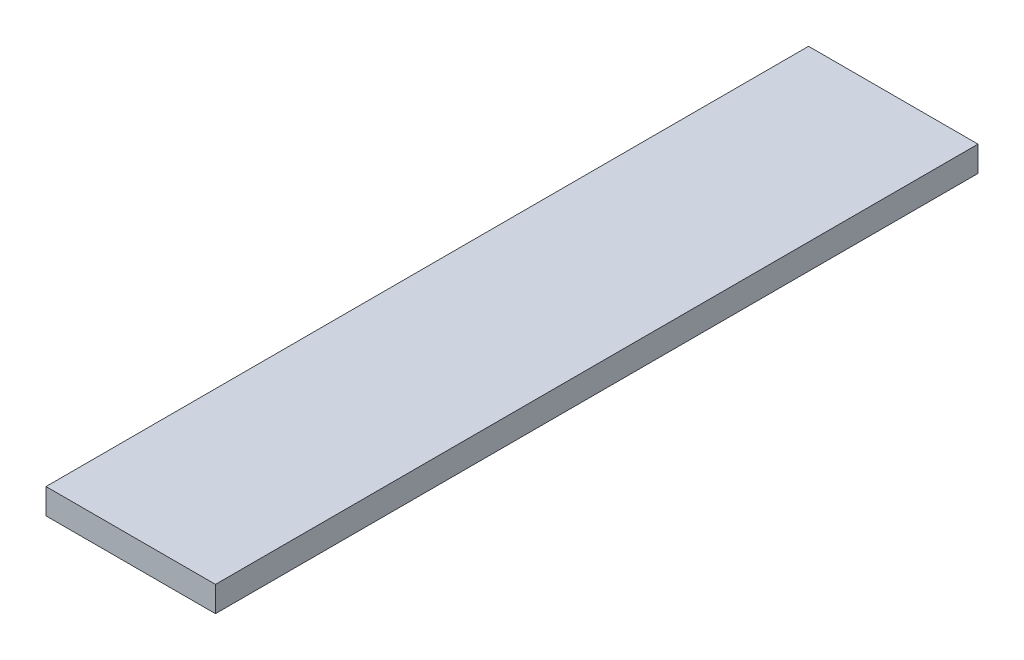
ISO-10303-21;
HEADER;
FILE_DESCRIPTION(('STEP AP214'),'2;1');
FILE_NAME('part.step','',(''),(''),'','','');
FILE_SCHEMA(('AUTOMOTIVE_DESIGN { 1 0 10303 214 1 1 1 1 }'));
ENDSEC;
DATA;
#1=APPLICATION_CONTEXT('core data for automotive mechanical design processes');
#2=APPLICATION_PROTOCOL_DEFINITION('international standard','automotive_design',2000,#1);
#3=PRODUCT_CONTEXT('',#1,'mechanical');
#4=PRODUCT('Part','Part','',(#3));
#5=PRODUCT_RELATED_PRODUCT_CATEGORY('part','',(#4));
#6=PRODUCT_DEFINITION_FORMATION('','',#4);
#7=PRODUCT_DEFINITION_CONTEXT('part definition',#1,'design');
#8=PRODUCT_DEFINITION('design','',#6,#7);
#9=PRODUCT_DEFINITION_SHAPE('','',#8);
#10=(LENGTH_UNIT() NAMED_UNIT(*) SI_UNIT(.MILLI.,.METRE.));
#11=(NAMED_UNIT(*) PLANE_ANGLE_UNIT() SI_UNIT($,.RADIAN.));
#12=(NAMED_UNIT(*) SI_UNIT($,.STERADIAN.) SOLID_ANGLE_UNIT());
#13=UNCERTAINTY_MEASURE_WITH_UNIT(LENGTH_MEASURE(1.E-05),#10,'distance_accuracy_value','');
#14=(GEOMETRIC_REPRESENTATION_CONTEXT(3) GLOBAL_UNCERTAINTY_ASSIGNED_CONTEXT((#13)) GLOBAL_UNIT_ASSIGNED_CONTEXT((#10,
#11,#12)) REPRESENTATION_CONTEXT('',''));
#15=CARTESIAN_POINT('',(0.,0.,0.));
#16=DIRECTION('',(0.,0.,1.));
#17=DIRECTION('',(1.,0.,0.));
#18=AXIS2_PLACEMENT_3D('',#15,#16,#17);
#19=CARTESIAN_POINT('',(-1500.,-1777.,3213.847577293));
#20=DIRECTION('',(0.,-1.,0.));
#21=DIRECTION('',(0.,0.,-1.));
#22=AXIS2_PLACEMENT_3D('',#19,#20,#21);
#23=PLANE('',#22);
#24=DIRECTION('',(1.,0.,0.));
#25=VECTOR('',#24,1.);
#26=CARTESIAN_POINT('',(-1520.,-1777.,3123.847577293));
#27=LINE('',#26,#25);
#28=CARTESIAN_POINT('',(-1520.,-1777.,3123.847577293));
#29=VERTEX_POINT('',#28);
#30=CARTESIAN_POINT('',(-1480.,-1777.,3123.847577293));
#31=VERTEX_POINT('',#30);
#32=EDGE_CURVE('E81',#29,#31,#27,.T.);
#33=ORIENTED_EDGE('',*,*,#32,.T.);
#34=DIRECTION('',(0.,0.,1.));
#35=VECTOR('',#34,1.);
#36=CARTESIAN_POINT('',(-1480.,-1777.,3123.847577293));
#37=LINE('',#36,#35);
#38=CARTESIAN_POINT('',(-1480.,-1777.,3303.847577293));
#39=VERTEX_POINT('',#38);
#40=EDGE_CURVE('E100',#31,#39,#37,.T.);
#41=ORIENTED_EDGE('',*,*,#40,.T.);
#42=DIRECTION('',(-1.,0.,0.));
#43=VECTOR('',#42,1.);
#44=CARTESIAN_POINT('',(-1480.,-1777.,3303.847577293));
#45=LINE('',#44,#43);
#46=CARTESIAN_POINT('',(-1520.,-1777.,3303.847577293));
#47=VERTEX_POINT('',#46);
#48=EDGE_CURVE('E74',#39,#47,#45,.T.);
#49=ORIENTED_EDGE('',*,*,#48,.T.);
#50=DIRECTION('',(0.,0.,-1.));
#51=VECTOR('',#50,1.);
#52=CARTESIAN_POINT('',(-1520.,-1777.,3303.847577293));
#53=LINE('',#52,#51);
#54=EDGE_CURVE('E11',#47,#29,#53,.T.);
#55=ORIENTED_EDGE('',*,*,#54,.T.);
#56=EDGE_LOOP('',(#33,#41,#49,#55));
#57=FACE_BOUND('',#56,.T.);
#58=ADVANCED_FACE('F17',(#57),#23,.T.);
#59=CARTESIAN_POINT('',(-1500.,-1771.,3213.847577293));
#60=DIRECTION('',(0.,-1.,0.));
#61=DIRECTION('',(0.,0.,-1.));
#62=AXIS2_PLACEMENT_3D('',#59,#60,#61);
#63=PLANE('',#62);
#64=DIRECTION('',(0.,0.,-1.));
#65=VECTOR('',#64,1.);
#66=CARTESIAN_POINT('',(-1520.,-1771.,3303.847577293));
#67=LINE('',#66,#65);
#68=CARTESIAN_POINT('',(-1520.,-1771.,3303.847577293));
#69=VERTEX_POINT('',#68);
#70=CARTESIAN_POINT('',(-1520.,-1771.,3123.847577293));
#71=VERTEX_POINT('',#70);
#72=EDGE_CURVE('E25',#69,#71,#67,.T.);
#73=ORIENTED_EDGE('',*,*,#72,.F.);
#74=DIRECTION('',(-1.,0.,0.));
#75=VECTOR('',#74,1.);
#76=CARTESIAN_POINT('',(-1480.,-1771.,3303.847577293));
#77=LINE('',#76,#75);
#78=CARTESIAN_POINT('',(-1480.,-1771.,3303.847577293));
#79=VERTEX_POINT('',#78);
#80=EDGE_CURVE('E104',#79,#69,#77,.T.);
#81=ORIENTED_EDGE('',*,*,#80,.F.);
#82=DIRECTION('',(0.,0.,1.));
#83=VECTOR('',#82,1.);
#84=CARTESIAN_POINT('',(-1480.,-1771.,3123.847577293));
#85=LINE('',#84,#83);
#86=CARTESIAN_POINT('',(-1480.,-1771.,3123.847577293));
#87=VERTEX_POINT('',#86);
#88=EDGE_CURVE('E83',#87,#79,#85,.T.);
#89=ORIENTED_EDGE('',*,*,#88,.F.);
#90=DIRECTION('',(1.,0.,0.));
#91=VECTOR('',#90,1.);
#92=CARTESIAN_POINT('',(-1520.,-1771.,3123.847577293));
#93=LINE('',#92,#91);
#94=EDGE_CURVE('E79',#71,#87,#93,.T.);
#95=ORIENTED_EDGE('',*,*,#94,.F.);
#96=EDGE_LOOP('',(#73,#81,#89,#95));
#97=FACE_BOUND('',#96,.T.);
#98=ADVANCED_FACE('F85',(#97),#63,.F.);
#99=CARTESIAN_POINT('',(-1520.,-1771.,3303.847577293));
#100=DIRECTION('',(1.,0.,0.));
#101=DIRECTION('',(0.,1.,0.));
#102=AXIS2_PLACEMENT_3D('',#99,#100,#101);
#103=PLANE('',#102);
#104=ORIENTED_EDGE('',*,*,#72,.T.);
#105=DIRECTION('',(0.,-1.,0.));
#106=VECTOR('',#105,1.);
#107=CARTESIAN_POINT('',(-1520.,-1771.,3123.847577293));
#108=LINE('',#107,#106);
#109=EDGE_CURVE('E68',#71,#29,#108,.T.);
#110=ORIENTED_EDGE('',*,*,#109,.T.);
#111=ORIENTED_EDGE('',*,*,#54,.F.);
#112=DIRECTION('',(0.,-1.,0.));
#113=VECTOR('',#112,1.);
#114=CARTESIAN_POINT('',(-1520.,-1771.,3303.847577293));
#115=LINE('',#114,#113);
#116=EDGE_CURVE('E71',#69,#47,#115,.T.);
#117=ORIENTED_EDGE('',*,*,#116,.F.);
#118=EDGE_LOOP('',(#104,#110,#111,#117));
#119=FACE_BOUND('',#118,.T.);
#120=ADVANCED_FACE('F67',(#119),#103,.F.);
#121=CARTESIAN_POINT('',(-1480.,-1771.,3303.847577293));
#122=DIRECTION('',(0.,0.,-1.));
#123=DIRECTION('',(0.,-1.,0.));
#124=AXIS2_PLACEMENT_3D('',#121,#122,#123);
#125=PLANE('',#124);
#126=ORIENTED_EDGE('',*,*,#80,.T.);
#127=ORIENTED_EDGE('',*,*,#116,.T.);
#128=ORIENTED_EDGE('',*,*,#48,.F.);
#129=DIRECTION('',(0.,-1.,0.));
#130=VECTOR('',#129,1.);
#131=CARTESIAN_POINT('',(-1480.,-1771.,3303.847577293));
#132=LINE('',#131,#130);
#133=EDGE_CURVE('E99',#79,#39,#132,.T.);
#134=ORIENTED_EDGE('',*,*,#133,.F.);
#135=EDGE_LOOP('',(#126,#127,#128,#134));
#136=FACE_BOUND('',#135,.T.);
#137=ADVANCED_FACE('F117',(#136),#125,.F.);
#138=CARTESIAN_POINT('',(-1480.,-1771.,3123.847577293));
#139=DIRECTION('',(-1.,0.,0.));
#140=DIRECTION('',(0.,0.,1.));
#141=AXIS2_PLACEMENT_3D('',#138,#139,#140);
#142=PLANE('',#141);
#143=ORIENTED_EDGE('',*,*,#88,.T.);
#144=ORIENTED_EDGE('',*,*,#133,.T.);
#145=ORIENTED_EDGE('',*,*,#40,.F.);
#146=DIRECTION('',(0.,-1.,0.));
#147=VECTOR('',#146,1.);
#148=CARTESIAN_POINT('',(-1480.,-1771.,3123.847577293));
#149=LINE('',#148,#147);
#150=EDGE_CURVE('E89',#87,#31,#149,.T.);
#151=ORIENTED_EDGE('',*,*,#150,.F.);
#152=EDGE_LOOP('',(#143,#144,#145,#151));
#153=FACE_BOUND('',#152,.T.);
#154=ADVANCED_FACE('F119',(#153),#142,.F.);
#155=CARTESIAN_POINT('',(-1520.,-1771.,3123.847577293));
#156=DIRECTION('',(0.,0.,1.));
#157=DIRECTION('',(1.,0.,0.));
#158=AXIS2_PLACEMENT_3D('',#155,#156,#157);
#159=PLANE('',#158);
#160=ORIENTED_EDGE('',*,*,#94,.T.);
#161=ORIENTED_EDGE('',*,*,#150,.T.);
#162=ORIENTED_EDGE('',*,*,#32,.F.);
#163=ORIENTED_EDGE('',*,*,#109,.F.);
#164=EDGE_LOOP('',(#160,#161,#162,#163));
#165=FACE_BOUND('',#164,.T.);
#166=ADVANCED_FACE('F77',(#165),#159,.F.);
#167=CLOSED_SHELL('',(#58,#98,#120,#137,#154,#166));
#168=MANIFOLD_SOLID_BREP('B1',#167);
#169=ADVANCED_BREP_SHAPE_REPRESENTATION('',(#18,#168),#14);
#170=SHAPE_DEFINITION_REPRESENTATION(#9,#169);
ENDSEC;
END-ISO-10303-21;
